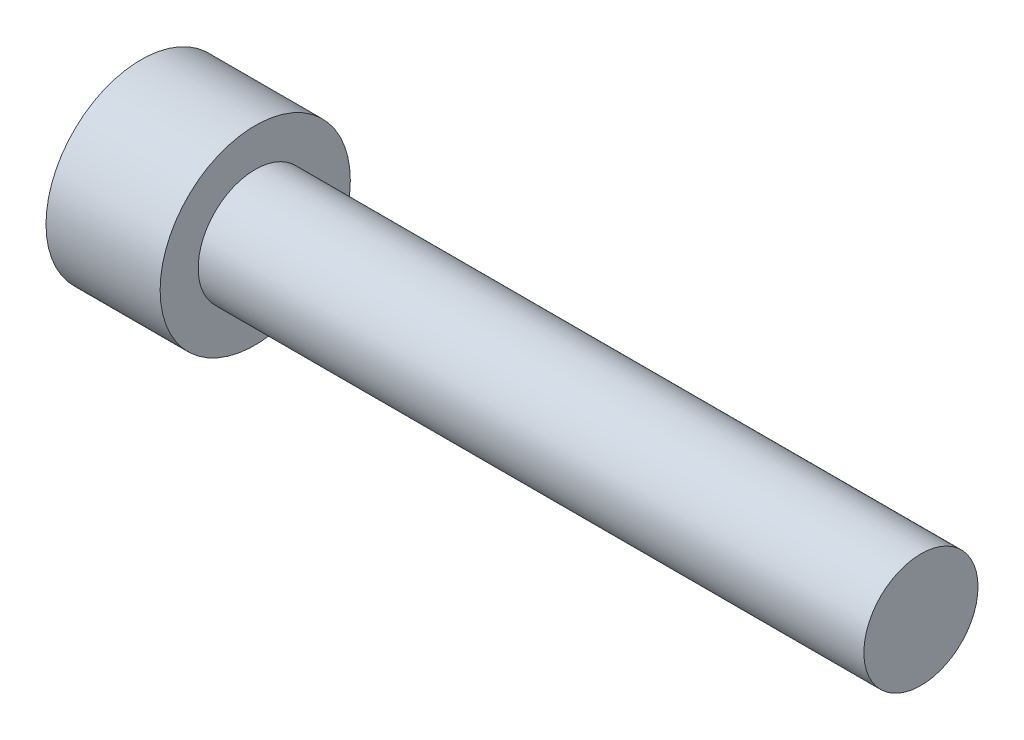
ISO-10303-21;
HEADER;
FILE_DESCRIPTION(('STEP AP214'),'2;1');
FILE_NAME('part.step','',(''),(''),'','','');
FILE_SCHEMA(('AUTOMOTIVE_DESIGN { 1 0 10303 214 1 1 1 1 }'));
ENDSEC;
DATA;
#1=APPLICATION_CONTEXT('core data for automotive mechanical design processes');
#2=APPLICATION_PROTOCOL_DEFINITION('international standard','automotive_design',2000,#1);
#3=PRODUCT_CONTEXT('',#1,'mechanical');
#4=PRODUCT('Part','Part','',(#3));
#5=PRODUCT_RELATED_PRODUCT_CATEGORY('part','',(#4));
#6=PRODUCT_DEFINITION_FORMATION('','',#4);
#7=PRODUCT_DEFINITION_CONTEXT('part definition',#1,'design');
#8=PRODUCT_DEFINITION('design','',#6,#7);
#9=PRODUCT_DEFINITION_SHAPE('','',#8);
#10=(LENGTH_UNIT() NAMED_UNIT(*) SI_UNIT(.MILLI.,.METRE.));
#11=(NAMED_UNIT(*) PLANE_ANGLE_UNIT() SI_UNIT($,.RADIAN.));
#12=(NAMED_UNIT(*) SI_UNIT($,.STERADIAN.) SOLID_ANGLE_UNIT());
#13=UNCERTAINTY_MEASURE_WITH_UNIT(LENGTH_MEASURE(1.E-05),#10,'distance_accuracy_value','');
#14=(GEOMETRIC_REPRESENTATION_CONTEXT(3) GLOBAL_UNCERTAINTY_ASSIGNED_CONTEXT((#13)) GLOBAL_UNIT_ASSIGNED_CONTEXT((#10,
#11,#12)) REPRESENTATION_CONTEXT('',''));
#15=CARTESIAN_POINT('',(0.,0.,0.));
#16=DIRECTION('',(0.,0.,1.));
#17=DIRECTION('',(1.,0.,0.));
#18=AXIS2_PLACEMENT_3D('',#15,#16,#17);
#19=CARTESIAN_POINT('',(6.,0.,0.));
#20=DIRECTION('',(-1.,0.,0.));
#21=DIRECTION('',(0.,0.,1.));
#22=AXIS2_PLACEMENT_3D('',#19,#20,#21);
#23=CYLINDRICAL_SURFACE('',#22,5.);
#24=CARTESIAN_POINT('',(6.,0.,0.));
#25=DIRECTION('',(1.,0.,0.));
#26=DIRECTION('',(0.,0.,-1.));
#27=AXIS2_PLACEMENT_3D('',#24,#25,#26);
#28=CIRCLE('',#27,5.);
#29=CARTESIAN_POINT('',(6.,0.,-5.));
#30=VERTEX_POINT('',#29);
#31=EDGE_CURVE('E11',#30,#30,#28,.T.);
#32=ORIENTED_EDGE('',*,*,#31,.F.);
#33=EDGE_LOOP('',(#32));
#34=FACE_BOUND('',#33,.T.);
#35=CARTESIAN_POINT('',(0.,0.,0.));
#36=DIRECTION('',(1.,0.,0.));
#37=DIRECTION('',(0.,0.,-1.));
#38=AXIS2_PLACEMENT_3D('',#35,#36,#37);
#39=CIRCLE('',#38,5.);
#40=CARTESIAN_POINT('',(0.,0.,-5.));
#41=VERTEX_POINT('',#40);
#42=EDGE_CURVE('E38',#41,#41,#39,.T.);
#43=ORIENTED_EDGE('',*,*,#42,.T.);
#44=EDGE_LOOP('',(#43));
#45=FACE_BOUND('',#44,.T.);
#46=ADVANCED_FACE('F35',(#34,#45),#23,.T.);
#47=CARTESIAN_POINT('',(6.,0.,0.));
#48=DIRECTION('',(1.,0.,0.));
#49=DIRECTION('',(0.,0.,-1.));
#50=AXIS2_PLACEMENT_3D('',#47,#48,#49);
#51=PLANE('',#50);
#52=CARTESIAN_POINT('',(6.,0.,0.));
#53=DIRECTION('',(1.,0.,0.));
#54=DIRECTION('',(0.,0.,-1.));
#55=AXIS2_PLACEMENT_3D('',#52,#53,#54);
#56=CIRCLE('',#55,3.);
#57=CARTESIAN_POINT('',(6.,0.,-3.));
#58=VERTEX_POINT('',#57);
#59=EDGE_CURVE('E153',#58,#58,#56,.T.);
#60=ORIENTED_EDGE('',*,*,#59,.F.);
#61=EDGE_LOOP('',(#60));
#62=FACE_BOUND('',#61,.T.);
#63=ORIENTED_EDGE('',*,*,#31,.T.);
#64=EDGE_LOOP('',(#63));
#65=FACE_BOUND('',#64,.T.);
#66=ADVANCED_FACE('F167',(#62,#65),#51,.T.);
#67=CARTESIAN_POINT('',(0.,0.,0.));
#68=DIRECTION('',(1.,0.,0.));
#69=DIRECTION('',(0.,0.,-1.));
#70=AXIS2_PLACEMENT_3D('',#67,#68,#69);
#71=PLANE('',#70);
#72=DIRECTION('',(0.,-0.500000000000009,-0.866025403784434));
#73=VECTOR('',#72,1.);
#74=CARTESIAN_POINT('',(0.,1.25000000000009,-2.16506350946104));
#75=LINE('',#74,#73);
#76=CARTESIAN_POINT('',(0.,2.50000000000004,0.));
#77=VERTEX_POINT('',#76);
#78=CARTESIAN_POINT('',(0.,1.25000000000009,-2.16506350946104));
#79=VERTEX_POINT('',#78);
#80=EDGE_CURVE('E123',#77,#79,#75,.T.);
#81=ORIENTED_EDGE('',*,*,#80,.F.);
#82=DIRECTION('',(0.,0.5,-0.866025403784439));
#83=VECTOR('',#82,1.);
#84=CARTESIAN_POINT('',(0.,2.50000000000004,0.));
#85=LINE('',#84,#83);
#86=CARTESIAN_POINT('',(0.,1.25000000000009,2.16506350946094));
#87=VERTEX_POINT('',#86);
#88=EDGE_CURVE('E49',#87,#77,#85,.T.);
#89=ORIENTED_EDGE('',*,*,#88,.F.);
#90=DIRECTION('',(0.,1.,0.));
#91=VECTOR('',#90,1.);
#92=CARTESIAN_POINT('',(0.,1.25000000000009,2.16506350946094));
#93=LINE('',#92,#91);
#94=CARTESIAN_POINT('',(0.,-1.24999999999982,2.16506350946094));
#95=VERTEX_POINT('',#94);
#96=EDGE_CURVE('E133',#95,#87,#93,.T.);
#97=ORIENTED_EDGE('',*,*,#96,.F.);
#98=DIRECTION('',(0.,0.500000000000008,0.866025403784434));
#99=VECTOR('',#98,1.);
#100=CARTESIAN_POINT('',(0.,-1.24999999999982,2.16506350946094));
#101=LINE('',#100,#99);
#102=CARTESIAN_POINT('',(0.,-2.49999999999982,-1.02827776143857E-13));
#103=VERTEX_POINT('',#102);
#104=EDGE_CURVE('E131',#103,#95,#101,.T.);
#105=ORIENTED_EDGE('',*,*,#104,.F.);
#106=DIRECTION('',(0.,-0.500000000000018,0.866025403784428));
#107=VECTOR('',#106,1.);
#108=CARTESIAN_POINT('',(0.,-2.49999999999982,-1.02827776143857E-13));
#109=LINE('',#108,#107);
#110=CARTESIAN_POINT('',(0.,-1.24999999999982,-2.1650635094611));
#111=VERTEX_POINT('',#110);
#112=EDGE_CURVE('E97',#111,#103,#109,.T.);
#113=ORIENTED_EDGE('',*,*,#112,.F.);
#114=DIRECTION('',(0.,-1.,0.));
#115=VECTOR('',#114,1.);
#116=CARTESIAN_POINT('',(0.,-1.24999999999982,-2.1650635094611));
#117=LINE('',#116,#115);
#118=EDGE_CURVE('E127',#79,#111,#117,.T.);
#119=ORIENTED_EDGE('',*,*,#118,.F.);
#120=EDGE_LOOP('',(#81,#89,#97,#105,#113,#119));
#121=FACE_BOUND('',#120,.T.);
#122=ORIENTED_EDGE('',*,*,#42,.F.);
#123=EDGE_LOOP('',(#122));
#124=FACE_BOUND('',#123,.T.);
#125=ADVANCED_FACE('F146',(#121,#124),#71,.F.);
#126=CARTESIAN_POINT('',(3.,2.50000000000004,0.));
#127=DIRECTION('',(0.,0.866025403784439,0.5));
#128=DIRECTION('',(0.,-0.5,0.866025403784439));
#129=AXIS2_PLACEMENT_3D('',#126,#127,#128);
#130=PLANE('',#129);
#131=ORIENTED_EDGE('',*,*,#88,.T.);
#132=DIRECTION('',(-1.,0.,0.));
#133=VECTOR('',#132,1.);
#134=CARTESIAN_POINT('',(3.,2.50000000000004,0.));
#135=LINE('',#134,#133);
#136=CARTESIAN_POINT('',(3.,2.50000000000004,0.));
#137=VERTEX_POINT('',#136);
#138=EDGE_CURVE('E79',#137,#77,#135,.T.);
#139=ORIENTED_EDGE('',*,*,#138,.F.);
#140=DIRECTION('',(0.,0.5,-0.866025403784439));
#141=VECTOR('',#140,1.);
#142=CARTESIAN_POINT('',(3.,2.50000000000004,0.));
#143=LINE('',#142,#141);
#144=CARTESIAN_POINT('',(3.,1.25000000000009,2.16506350946094));
#145=VERTEX_POINT('',#144);
#146=EDGE_CURVE('E135',#145,#137,#143,.T.);
#147=ORIENTED_EDGE('',*,*,#146,.F.);
#148=DIRECTION('',(-1.,0.,0.));
#149=VECTOR('',#148,1.);
#150=CARTESIAN_POINT('',(3.,1.25000000000009,2.16506350946094));
#151=LINE('',#150,#149);
#152=EDGE_CURVE('E57',#145,#87,#151,.T.);
#153=ORIENTED_EDGE('',*,*,#152,.T.);
#154=EDGE_LOOP('',(#131,#139,#147,#153));
#155=FACE_BOUND('',#154,.T.);
#156=ADVANCED_FACE('F178',(#155),#130,.F.);
#157=CARTESIAN_POINT('',(3.,1.25000000000009,2.16506350946094));
#158=DIRECTION('',(0.,0.,1.));
#159=DIRECTION('',(0.,-1.,0.));
#160=AXIS2_PLACEMENT_3D('',#157,#158,#159);
#161=PLANE('',#160);
#162=ORIENTED_EDGE('',*,*,#96,.T.);
#163=ORIENTED_EDGE('',*,*,#152,.F.);
#164=DIRECTION('',(0.,1.,0.));
#165=VECTOR('',#164,1.);
#166=CARTESIAN_POINT('',(3.,1.25000000000009,2.16506350946094));
#167=LINE('',#166,#165);
#168=CARTESIAN_POINT('',(3.,-1.24999999999982,2.16506350946094));
#169=VERTEX_POINT('',#168);
#170=EDGE_CURVE('E109',#169,#145,#167,.T.);
#171=ORIENTED_EDGE('',*,*,#170,.F.);
#172=DIRECTION('',(-1.,0.,0.));
#173=VECTOR('',#172,1.);
#174=CARTESIAN_POINT('',(3.,-1.24999999999982,2.16506350946094));
#175=LINE('',#174,#173);
#176=EDGE_CURVE('E101',#169,#95,#175,.T.);
#177=ORIENTED_EDGE('',*,*,#176,.T.);
#178=EDGE_LOOP('',(#162,#163,#171,#177));
#179=FACE_BOUND('',#178,.T.);
#180=ADVANCED_FACE('F182',(#179),#161,.F.);
#181=CARTESIAN_POINT('',(3.,-1.24999999999982,2.16506350946094));
#182=DIRECTION('',(0.,-0.866025403784434,0.500000000000008));
#183=DIRECTION('',(0.,-0.500000000000008,-0.866025403784434));
#184=AXIS2_PLACEMENT_3D('',#181,#182,#183);
#185=PLANE('',#184);
#186=ORIENTED_EDGE('',*,*,#104,.T.);
#187=ORIENTED_EDGE('',*,*,#176,.F.);
#188=DIRECTION('',(0.,0.500000000000008,0.866025403784434));
#189=VECTOR('',#188,1.);
#190=CARTESIAN_POINT('',(3.,-1.24999999999982,2.16506350946094));
#191=LINE('',#190,#189);
#192=CARTESIAN_POINT('',(3.,-2.49999999999982,-1.02827776143857E-13));
#193=VERTEX_POINT('',#192);
#194=EDGE_CURVE('E105',#193,#169,#191,.T.);
#195=ORIENTED_EDGE('',*,*,#194,.F.);
#196=DIRECTION('',(-1.,0.,0.));
#197=VECTOR('',#196,1.);
#198=CARTESIAN_POINT('',(3.,-2.49999999999982,-1.02827776143857E-13));
#199=LINE('',#198,#197);
#200=EDGE_CURVE('E90',#193,#103,#199,.T.);
#201=ORIENTED_EDGE('',*,*,#200,.T.);
#202=EDGE_LOOP('',(#186,#187,#195,#201));
#203=FACE_BOUND('',#202,.T.);
#204=ADVANCED_FACE('F106',(#203),#185,.F.);
#205=CARTESIAN_POINT('',(3.,-2.49999999999982,-1.02827776143857E-13));
#206=DIRECTION('',(0.,-0.866025403784428,-0.500000000000018));
#207=DIRECTION('',(0.,0.500000000000018,-0.866025403784428));
#208=AXIS2_PLACEMENT_3D('',#205,#206,#207);
#209=PLANE('',#208);
#210=ORIENTED_EDGE('',*,*,#112,.T.);
#211=ORIENTED_EDGE('',*,*,#200,.F.);
#212=DIRECTION('',(0.,-0.500000000000018,0.866025403784428));
#213=VECTOR('',#212,1.);
#214=CARTESIAN_POINT('',(3.,-2.49999999999982,-1.02827776143857E-13));
#215=LINE('',#214,#213);
#216=CARTESIAN_POINT('',(3.,-1.24999999999982,-2.1650635094611));
#217=VERTEX_POINT('',#216);
#218=EDGE_CURVE('E94',#217,#193,#215,.T.);
#219=ORIENTED_EDGE('',*,*,#218,.F.);
#220=DIRECTION('',(-1.,0.,0.));
#221=VECTOR('',#220,1.);
#222=CARTESIAN_POINT('',(3.,-1.24999999999982,-2.1650635094611));
#223=LINE('',#222,#221);
#224=EDGE_CURVE('E102',#217,#111,#223,.T.);
#225=ORIENTED_EDGE('',*,*,#224,.T.);
#226=EDGE_LOOP('',(#210,#211,#219,#225));
#227=FACE_BOUND('',#226,.T.);
#228=ADVANCED_FACE('F92',(#227),#209,.F.);
#229=CARTESIAN_POINT('',(3.,-1.24999999999982,-2.1650635094611));
#230=DIRECTION('',(0.,0.,-1.));
#231=DIRECTION('',(0.,1.,0.));
#232=AXIS2_PLACEMENT_3D('',#229,#230,#231);
#233=PLANE('',#232);
#234=ORIENTED_EDGE('',*,*,#118,.T.);
#235=ORIENTED_EDGE('',*,*,#224,.F.);
#236=DIRECTION('',(0.,-1.,0.));
#237=VECTOR('',#236,1.);
#238=CARTESIAN_POINT('',(3.,-1.24999999999982,-2.1650635094611));
#239=LINE('',#238,#237);
#240=CARTESIAN_POINT('',(3.,1.25000000000009,-2.16506350946104));
#241=VERTEX_POINT('',#240);
#242=EDGE_CURVE('E115',#241,#217,#239,.T.);
#243=ORIENTED_EDGE('',*,*,#242,.F.);
#244=DIRECTION('',(-1.,0.,0.));
#245=VECTOR('',#244,1.);
#246=CARTESIAN_POINT('',(3.,1.25000000000009,-2.16506350946104));
#247=LINE('',#246,#245);
#248=EDGE_CURVE('E139',#241,#79,#247,.T.);
#249=ORIENTED_EDGE('',*,*,#248,.T.);
#250=EDGE_LOOP('',(#234,#235,#243,#249));
#251=FACE_BOUND('',#250,.T.);
#252=ADVANCED_FACE('F150',(#251),#233,.F.);
#253=CARTESIAN_POINT('',(3.,1.25000000000009,-2.16506350946104));
#254=DIRECTION('',(0.,0.866025403784434,-0.500000000000009));
#255=DIRECTION('',(0.,0.500000000000009,0.866025403784434));
#256=AXIS2_PLACEMENT_3D('',#253,#254,#255);
#257=PLANE('',#256);
#258=ORIENTED_EDGE('',*,*,#80,.T.);
#259=ORIENTED_EDGE('',*,*,#248,.F.);
#260=DIRECTION('',(0.,-0.500000000000009,-0.866025403784434));
#261=VECTOR('',#260,1.);
#262=CARTESIAN_POINT('',(3.,1.25000000000009,-2.16506350946104));
#263=LINE('',#262,#261);
#264=EDGE_CURVE('E117',#137,#241,#263,.T.);
#265=ORIENTED_EDGE('',*,*,#264,.F.);
#266=ORIENTED_EDGE('',*,*,#138,.T.);
#267=EDGE_LOOP('',(#258,#259,#265,#266));
#268=FACE_BOUND('',#267,.T.);
#269=ADVANCED_FACE('F143',(#268),#257,.F.);
#270=CARTESIAN_POINT('',(3.,0.,0.));
#271=DIRECTION('',(1.,0.,0.));
#272=DIRECTION('',(0.,0.,-1.));
#273=AXIS2_PLACEMENT_3D('',#270,#271,#272);
#274=PLANE('',#273);
#275=ORIENTED_EDGE('',*,*,#146,.T.);
#276=ORIENTED_EDGE('',*,*,#264,.T.);
#277=ORIENTED_EDGE('',*,*,#242,.T.);
#278=ORIENTED_EDGE('',*,*,#218,.T.);
#279=ORIENTED_EDGE('',*,*,#194,.T.);
#280=ORIENTED_EDGE('',*,*,#170,.T.);
#281=EDGE_LOOP('',(#275,#276,#277,#278,#279,#280));
#282=FACE_BOUND('',#281,.T.);
#283=ADVANCED_FACE('F112',(#282),#274,.F.);
#284=CARTESIAN_POINT('',(41.,0.,0.));
#285=DIRECTION('',(-1.,0.,0.));
#286=DIRECTION('',(0.,0.,1.));
#287=AXIS2_PLACEMENT_3D('',#284,#285,#286);
#288=CYLINDRICAL_SURFACE('',#287,3.);
#289=CARTESIAN_POINT('',(41.,0.,0.));
#290=DIRECTION('',(1.,0.,0.));
#291=DIRECTION('',(0.,0.,-1.));
#292=AXIS2_PLACEMENT_3D('',#289,#290,#291);
#293=CIRCLE('',#292,3.);
#294=CARTESIAN_POINT('',(41.,0.,-3.));
#295=VERTEX_POINT('',#294);
#296=EDGE_CURVE('E124',#295,#295,#293,.T.);
#297=ORIENTED_EDGE('',*,*,#296,.F.);
#298=EDGE_LOOP('',(#297));
#299=FACE_BOUND('',#298,.T.);
#300=ORIENTED_EDGE('',*,*,#59,.T.);
#301=EDGE_LOOP('',(#300));
#302=FACE_BOUND('',#301,.T.);
#303=ADVANCED_FACE('F161',(#299,#302),#288,.T.);
#304=CARTESIAN_POINT('',(41.,0.,0.));
#305=DIRECTION('',(1.,0.,0.));
#306=DIRECTION('',(0.,0.,-1.));
#307=AXIS2_PLACEMENT_3D('',#304,#305,#306);
#308=PLANE('',#307);
#309=ORIENTED_EDGE('',*,*,#296,.T.);
#310=EDGE_LOOP('',(#309));
#311=FACE_BOUND('',#310,.T.);
#312=ADVANCED_FACE('F159',(#311),#308,.T.);
#313=CLOSED_SHELL('',(#46,#66,#125,#156,#180,#204,#228,#252,#269,#283,#303,#312));
#314=MANIFOLD_SOLID_BREP('B2',#313);
#315=ADVANCED_BREP_SHAPE_REPRESENTATION('',(#18,#314),#14);
#316=SHAPE_DEFINITION_REPRESENTATION(#9,#315);
ENDSEC;
END-ISO-10303-21;
